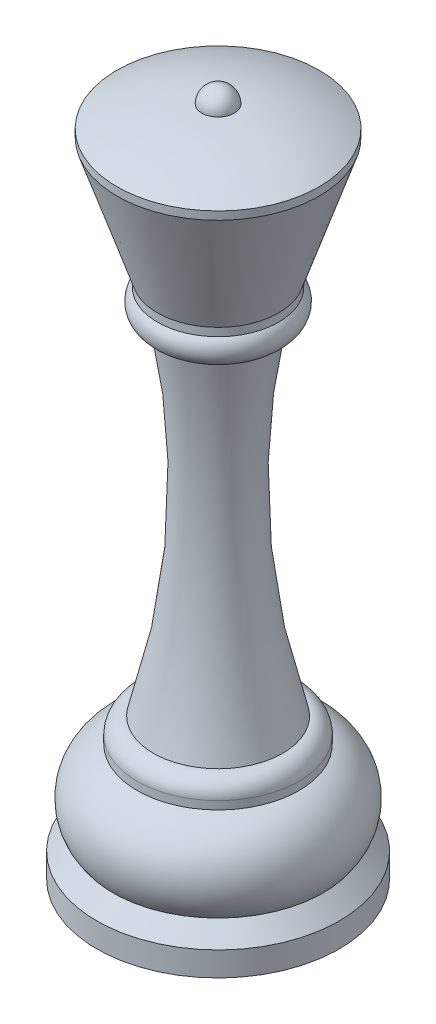
ISO-10303-21;
HEADER;
FILE_DESCRIPTION(('STEP AP214'),'2;1');
FILE_NAME('part.step','',(''),(''),'','','');
FILE_SCHEMA(('AUTOMOTIVE_DESIGN { 1 0 10303 214 1 1 1 1 }'));
ENDSEC;
DATA;
#1=APPLICATION_CONTEXT('core data for automotive mechanical design processes');
#2=APPLICATION_PROTOCOL_DEFINITION('international standard','automotive_design',2000,#1);
#3=PRODUCT_CONTEXT('',#1,'mechanical');
#4=PRODUCT('Part','Part','',(#3));
#5=PRODUCT_RELATED_PRODUCT_CATEGORY('part','',(#4));
#6=PRODUCT_DEFINITION_FORMATION('','',#4);
#7=PRODUCT_DEFINITION_CONTEXT('part definition',#1,'design');
#8=PRODUCT_DEFINITION('design','',#6,#7);
#9=PRODUCT_DEFINITION_SHAPE('','',#8);
#10=(LENGTH_UNIT() NAMED_UNIT(*) SI_UNIT(.MILLI.,.METRE.));
#11=(NAMED_UNIT(*) PLANE_ANGLE_UNIT() SI_UNIT($,.RADIAN.));
#12=(NAMED_UNIT(*) SI_UNIT($,.STERADIAN.) SOLID_ANGLE_UNIT());
#13=UNCERTAINTY_MEASURE_WITH_UNIT(LENGTH_MEASURE(1.E-05),#10,'distance_accuracy_value','');
#14=(GEOMETRIC_REPRESENTATION_CONTEXT(3) GLOBAL_UNCERTAINTY_ASSIGNED_CONTEXT((#13)) GLOBAL_UNIT_ASSIGNED_CONTEXT((#10,
#11,#12)) REPRESENTATION_CONTEXT('',''));
#15=CARTESIAN_POINT('',(0.,0.,0.));
#16=DIRECTION('',(0.,0.,1.));
#17=DIRECTION('',(1.,0.,0.));
#18=AXIS2_PLACEMENT_3D('',#15,#16,#17);
#19=CARTESIAN_POINT('',(0.,58.0095419582904,0.));
#20=DIRECTION('',(0.,-1.,0.));
#21=DIRECTION('',(0.,0.,-1.));
#22=AXIS2_PLACEMENT_3D('',#19,#20,#21);
#23=DEGENERATE_TOROIDAL_SURFACE('',#22,1.3093431636809,25.,.T.);
#24=CARTESIAN_POINT('',(0.,83.,0.));
#25=DIRECTION('',(0.,-1.,0.));
#26=DIRECTION('',(0.,0.,-1.));
#27=AXIS2_PLACEMENT_3D('',#24,#25,#26);
#28=CIRCLE('',#27,2.);
#29=CARTESIAN_POINT('',(0.,83.,-2.));
#30=VERTEX_POINT('',#29);
#31=EDGE_CURVE('E90',#30,#30,#28,.T.);
#32=ORIENTED_EDGE('',*,*,#31,.T.);
#33=EDGE_LOOP('',(#32));
#34=FACE_BOUND('',#33,.T.);
#35=CARTESIAN_POINT('',(0.,80.365060283119,0.));
#36=DIRECTION('',(0.,-1.,0.));
#37=DIRECTION('',(0.,0.,-1.));
#38=AXIS2_PLACEMENT_3D('',#35,#36,#37);
#39=CIRCLE('',#38,12.5);
#40=CARTESIAN_POINT('',(0.,80.365060283119,-12.5));
#41=VERTEX_POINT('',#40);
#42=EDGE_CURVE('E10',#41,#41,#39,.T.);
#43=ORIENTED_EDGE('',*,*,#42,.F.);
#44=EDGE_LOOP('',(#43));
#45=FACE_BOUND('',#44,.T.);
#46=ADVANCED_FACE('F39',(#34,#45),#23,.T.);
#47=CARTESIAN_POINT('',(0.,0.,0.));
#48=DIRECTION('',(0.,-1.,0.));
#49=DIRECTION('',(0.,0.,-1.));
#50=AXIS2_PLACEMENT_3D('',#47,#48,#49);
#51=CYLINDRICAL_SURFACE('',#50,12.5);
#52=ORIENTED_EDGE('',*,*,#42,.T.);
#53=EDGE_LOOP('',(#52));
#54=FACE_BOUND('',#53,.T.);
#55=CARTESIAN_POINT('',(0.,79.365060283119,0.));
#56=DIRECTION('',(0.,-1.,0.));
#57=DIRECTION('',(0.,0.,-1.));
#58=AXIS2_PLACEMENT_3D('',#55,#56,#57);
#59=CIRCLE('',#58,12.5);
#60=CARTESIAN_POINT('',(0.,79.365060283119,-12.5));
#61=VERTEX_POINT('',#60);
#62=EDGE_CURVE('E46',#61,#61,#59,.T.);
#63=ORIENTED_EDGE('',*,*,#62,.F.);
#64=EDGE_LOOP('',(#63));
#65=FACE_BOUND('',#64,.T.);
#66=ADVANCED_FACE('F108',(#54,#65),#51,.T.);
#67=CARTESIAN_POINT('',(0.,64.365060283119,0.));
#68=DIRECTION('',(0.,1.,0.));
#69=DIRECTION('',(0.,0.,1.));
#70=AXIS2_PLACEMENT_3D('',#67,#68,#69);
#71=CONICAL_SURFACE('',#70,7.5,0.321750554396642);
#72=ORIENTED_EDGE('',*,*,#62,.T.);
#73=EDGE_LOOP('',(#72));
#74=FACE_BOUND('',#73,.T.);
#75=CARTESIAN_POINT('',(0.,64.365060283119,0.));
#76=DIRECTION('',(0.,-1.,0.));
#77=DIRECTION('',(0.,0.,-1.));
#78=AXIS2_PLACEMENT_3D('',#75,#76,#77);
#79=CIRCLE('',#78,7.5);
#80=CARTESIAN_POINT('',(0.,64.365060283119,-7.5));
#81=VERTEX_POINT('',#80);
#82=EDGE_CURVE('E51',#81,#81,#79,.T.);
#83=ORIENTED_EDGE('',*,*,#82,.F.);
#84=EDGE_LOOP('',(#83));
#85=FACE_BOUND('',#84,.T.);
#86=ADVANCED_FACE('F112',(#74,#85),#71,.T.);
#87=CARTESIAN_POINT('',(0.,0.,0.));
#88=DIRECTION('',(0.,-1.,0.));
#89=DIRECTION('',(0.,0.,-1.));
#90=AXIS2_PLACEMENT_3D('',#87,#88,#89);
#91=CYLINDRICAL_SURFACE('',#90,7.5);
#92=ORIENTED_EDGE('',*,*,#82,.T.);
#93=EDGE_LOOP('',(#92));
#94=FACE_BOUND('',#93,.T.);
#95=CARTESIAN_POINT('',(0.,63.365060283119,0.));
#96=DIRECTION('',(0.,-1.,0.));
#97=DIRECTION('',(0.,0.,-1.));
#98=AXIS2_PLACEMENT_3D('',#95,#96,#97);
#99=CIRCLE('',#98,7.5);
#100=CARTESIAN_POINT('',(0.,63.365060283119,-7.5));
#101=VERTEX_POINT('',#100);
#102=EDGE_CURVE('E56',#101,#101,#99,.T.);
#103=ORIENTED_EDGE('',*,*,#102,.F.);
#104=EDGE_LOOP('',(#103));
#105=FACE_BOUND('',#104,.T.);
#106=ADVANCED_FACE('F116',(#94,#105),#91,.T.);
#107=CARTESIAN_POINT('',(0.,61.8773934616076,0.));
#108=DIRECTION('',(0.,-1.,0.));
#109=DIRECTION('',(0.,0.,-1.));
#110=AXIS2_PLACEMENT_3D('',#107,#108,#109);
#111=TOROIDAL_SURFACE('',#110,6.16326987459166,2.00000000000005);
#112=ORIENTED_EDGE('',*,*,#102,.T.);
#113=EDGE_LOOP('',(#112));
#114=FACE_BOUND('',#113,.T.);
#115=CARTESIAN_POINT('',(0.,59.8840688648469,0.));
#116=DIRECTION('',(0.,-1.,0.));
#117=DIRECTION('',(0.,0.,-1.));
#118=AXIS2_PLACEMENT_3D('',#115,#116,#117);
#119=CIRCLE('',#118,6.00000000000002);
#120=CARTESIAN_POINT('',(0.,59.8840688648469,-6.00000000000002));
#121=VERTEX_POINT('',#120);
#122=EDGE_CURVE('E62',#121,#121,#119,.T.);
#123=ORIENTED_EDGE('',*,*,#122,.F.);
#124=EDGE_LOOP('',(#123));
#125=FACE_BOUND('',#124,.T.);
#126=ADVANCED_FACE('F122',(#114,#125),#111,.T.);
#127=CARTESIAN_POINT('',(0.,42.7869631945769,0.));
#128=DIRECTION('',(0.,-1.,0.));
#129=DIRECTION('',(0.,0.,-1.));
#130=AXIS2_PLACEMENT_3D('',#127,#128,#129);
#131=TOROIDAL_SURFACE('',#130,94.3611282052217,90.);
#132=ORIENTED_EDGE('',*,*,#122,.T.);
#133=EDGE_LOOP('',(#132));
#134=FACE_BOUND('',#133,.T.);
#135=CARTESIAN_POINT('',(0.,17.4540688648469,0.));
#136=DIRECTION('',(0.,-1.,0.));
#137=DIRECTION('',(0.,0.,-1.));
#138=AXIS2_PLACEMENT_3D('',#135,#136,#137);
#139=CIRCLE('',#138,8.);
#140=CARTESIAN_POINT('',(0.,17.4540688648469,-8.));
#141=VERTEX_POINT('',#140);
#142=EDGE_CURVE('E66',#141,#141,#139,.T.);
#143=ORIENTED_EDGE('',*,*,#142,.F.);
#144=EDGE_LOOP('',(#143));
#145=FACE_BOUND('',#144,.T.);
#146=ADVANCED_FACE('F126',(#134,#145),#131,.F.);
#147=CARTESIAN_POINT('',(0.,15.4540688648469,0.));
#148=DIRECTION('',(0.,-1.,0.));
#149=DIRECTION('',(0.,0.,-1.));
#150=AXIS2_PLACEMENT_3D('',#147,#148,#149);
#151=TOROIDAL_SURFACE('',#150,8.,2.);
#152=ORIENTED_EDGE('',*,*,#142,.T.);
#153=EDGE_LOOP('',(#152));
#154=FACE_BOUND('',#153,.T.);
#155=CARTESIAN_POINT('',(0.,15.4540688648469,0.));
#156=DIRECTION('',(0.,-1.,0.));
#157=DIRECTION('',(0.,0.,-1.));
#158=AXIS2_PLACEMENT_3D('',#155,#156,#157);
#159=CIRCLE('',#158,10.);
#160=CARTESIAN_POINT('',(0.,15.4540688648469,-10.));
#161=VERTEX_POINT('',#160);
#162=EDGE_CURVE('E70',#161,#161,#159,.T.);
#163=ORIENTED_EDGE('',*,*,#162,.F.);
#164=EDGE_LOOP('',(#163));
#165=FACE_BOUND('',#164,.T.);
#166=ADVANCED_FACE('F130',(#154,#165),#151,.T.);
#167=CARTESIAN_POINT('',(0.,0.,0.));
#168=DIRECTION('',(0.,-1.,0.));
#169=DIRECTION('',(0.,0.,-1.));
#170=AXIS2_PLACEMENT_3D('',#167,#168,#169);
#171=CYLINDRICAL_SURFACE('',#170,10.);
#172=ORIENTED_EDGE('',*,*,#162,.T.);
#173=EDGE_LOOP('',(#172));
#174=FACE_BOUND('',#173,.T.);
#175=CARTESIAN_POINT('',(0.,14.4540688648469,0.));
#176=DIRECTION('',(0.,-1.,0.));
#177=DIRECTION('',(0.,0.,-1.));
#178=AXIS2_PLACEMENT_3D('',#175,#176,#177);
#179=CIRCLE('',#178,10.);
#180=CARTESIAN_POINT('',(0.,14.4540688648469,-10.));
#181=VERTEX_POINT('',#180);
#182=EDGE_CURVE('E74',#181,#181,#179,.T.);
#183=ORIENTED_EDGE('',*,*,#182,.F.);
#184=EDGE_LOOP('',(#183));
#185=FACE_BOUND('',#184,.T.);
#186=ADVANCED_FACE('F134',(#174,#185),#171,.T.);
#187=CARTESIAN_POINT('',(0.,8.70557871285518,0.));
#188=DIRECTION('',(0.,-1.,0.));
#189=DIRECTION('',(0.,0.,-1.));
#190=AXIS2_PLACEMENT_3D('',#187,#188,#189);
#191=TOROIDAL_SURFACE('',#190,8.28102909493664,6.);
#192=ORIENTED_EDGE('',*,*,#182,.T.);
#193=EDGE_LOOP('',(#192));
#194=FACE_BOUND('',#193,.T.);
#195=CARTESIAN_POINT('',(0.,5.,0.));
#196=DIRECTION('',(0.,-1.,0.));
#197=DIRECTION('',(0.,0.,-1.));
#198=AXIS2_PLACEMENT_3D('',#195,#196,#197);
#199=CIRCLE('',#198,13.);
#200=CARTESIAN_POINT('',(0.,5.,-13.));
#201=VERTEX_POINT('',#200);
#202=EDGE_CURVE('E78',#201,#201,#199,.T.);
#203=ORIENTED_EDGE('',*,*,#202,.F.);
#204=EDGE_LOOP('',(#203));
#205=FACE_BOUND('',#204,.T.);
#206=ADVANCED_FACE('F138',(#194,#205),#191,.T.);
#207=CARTESIAN_POINT('',(0.,3.,0.));
#208=DIRECTION('',(0.,-1.,0.));
#209=DIRECTION('',(0.,0.,-1.));
#210=AXIS2_PLACEMENT_3D('',#207,#208,#209);
#211=CONICAL_SURFACE('',#210,15.,0.785398163397448);
#212=ORIENTED_EDGE('',*,*,#202,.T.);
#213=EDGE_LOOP('',(#212));
#214=FACE_BOUND('',#213,.T.);
#215=CARTESIAN_POINT('',(0.,3.,0.));
#216=DIRECTION('',(0.,-1.,0.));
#217=DIRECTION('',(0.,0.,-1.));
#218=AXIS2_PLACEMENT_3D('',#215,#216,#217);
#219=CIRCLE('',#218,15.);
#220=CARTESIAN_POINT('',(0.,3.,-15.));
#221=VERTEX_POINT('',#220);
#222=EDGE_CURVE('E82',#221,#221,#219,.T.);
#223=ORIENTED_EDGE('',*,*,#222,.F.);
#224=EDGE_LOOP('',(#223));
#225=FACE_BOUND('',#224,.T.);
#226=ADVANCED_FACE('F142',(#214,#225),#211,.T.);
#227=CARTESIAN_POINT('',(0.,0.,0.));
#228=DIRECTION('',(0.,-1.,0.));
#229=DIRECTION('',(0.,0.,-1.));
#230=AXIS2_PLACEMENT_3D('',#227,#228,#229);
#231=CYLINDRICAL_SURFACE('',#230,15.);
#232=ORIENTED_EDGE('',*,*,#222,.T.);
#233=EDGE_LOOP('',(#232));
#234=FACE_BOUND('',#233,.T.);
#235=CARTESIAN_POINT('',(0.,0.,0.));
#236=DIRECTION('',(0.,-1.,0.));
#237=DIRECTION('',(0.,0.,-1.));
#238=AXIS2_PLACEMENT_3D('',#235,#236,#237);
#239=CIRCLE('',#238,15.);
#240=CARTESIAN_POINT('',(0.,0.,-15.));
#241=VERTEX_POINT('',#240);
#242=EDGE_CURVE('E86',#241,#241,#239,.T.);
#243=ORIENTED_EDGE('',*,*,#242,.F.);
#244=EDGE_LOOP('',(#243));
#245=FACE_BOUND('',#244,.T.);
#246=ADVANCED_FACE('F104',(#234,#245),#231,.T.);
#247=CARTESIAN_POINT('',(0.,0.,0.));
#248=DIRECTION('',(0.,-1.,0.));
#249=DIRECTION('',(0.,0.,-1.));
#250=AXIS2_PLACEMENT_3D('',#247,#248,#249);
#251=PLANE('',#250);
#252=ORIENTED_EDGE('',*,*,#242,.T.);
#253=EDGE_LOOP('',(#252));
#254=FACE_BOUND('',#253,.T.);
#255=ADVANCED_FACE('F99',(#254),#251,.T.);
#256=CARTESIAN_POINT('',(0.,83.,0.));
#257=DIRECTION('',(0.,-1.,0.));
#258=DIRECTION('',(-1.,0.,0.));
#259=AXIS2_PLACEMENT_3D('',#256,#257,#258);
#260=SPHERICAL_SURFACE('',#259,2.);
#261=ORIENTED_EDGE('',*,*,#31,.F.);
#262=EDGE_LOOP('',(#261));
#263=FACE_BOUND('',#262,.T.);
#264=ADVANCED_FACE('F97',(#263),#260,.T.);
#265=CLOSED_SHELL('',(#46,#66,#86,#106,#126,#146,#166,#186,#206,#226,#246,#255,#264));
#266=MANIFOLD_SOLID_BREP('B2',#265);
#267=ADVANCED_BREP_SHAPE_REPRESENTATION('',(#18,#266),#14);
#268=SHAPE_DEFINITION_REPRESENTATION(#9,#267);
ENDSEC;
END-ISO-10303-21;
